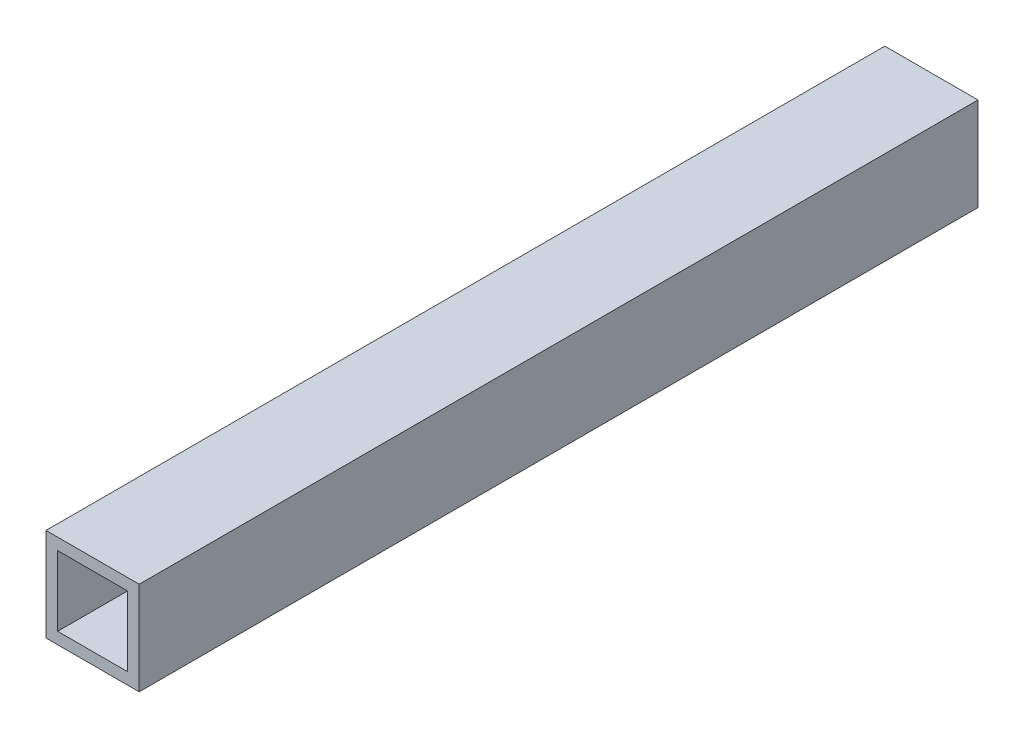
ISO-10303-21;
HEADER;
FILE_DESCRIPTION(('STEP AP214'),'2;1');
FILE_NAME('part.step','',(''),(''),'','','');
FILE_SCHEMA(('AUTOMOTIVE_DESIGN { 1 0 10303 214 1 1 1 1 }'));
ENDSEC;
DATA;
#1=APPLICATION_CONTEXT('core data for automotive mechanical design processes');
#2=APPLICATION_PROTOCOL_DEFINITION('international standard','automotive_design',2000,#1);
#3=PRODUCT_CONTEXT('',#1,'mechanical');
#4=PRODUCT('Part','Part','',(#3));
#5=PRODUCT_RELATED_PRODUCT_CATEGORY('part','',(#4));
#6=PRODUCT_DEFINITION_FORMATION('','',#4);
#7=PRODUCT_DEFINITION_CONTEXT('part definition',#1,'design');
#8=PRODUCT_DEFINITION('design','',#6,#7);
#9=PRODUCT_DEFINITION_SHAPE('','',#8);
#10=(LENGTH_UNIT() NAMED_UNIT(*) SI_UNIT(.MILLI.,.METRE.));
#11=(NAMED_UNIT(*) PLANE_ANGLE_UNIT() SI_UNIT($,.RADIAN.));
#12=(NAMED_UNIT(*) SI_UNIT($,.STERADIAN.) SOLID_ANGLE_UNIT());
#13=UNCERTAINTY_MEASURE_WITH_UNIT(LENGTH_MEASURE(1.E-05),#10,'distance_accuracy_value','');
#14=(GEOMETRIC_REPRESENTATION_CONTEXT(3) GLOBAL_UNCERTAINTY_ASSIGNED_CONTEXT((#13)) GLOBAL_UNIT_ASSIGNED_CONTEXT((#10,
#11,#12)) REPRESENTATION_CONTEXT('',''));
#15=CARTESIAN_POINT('',(0.,0.,0.));
#16=DIRECTION('',(0.,0.,1.));
#17=DIRECTION('',(1.,0.,0.));
#18=AXIS2_PLACEMENT_3D('',#15,#16,#17);
#19=CARTESIAN_POINT('',(0.,0.,114.3));
#20=DIRECTION('',(0.,0.,-1.));
#21=DIRECTION('',(-1.,0.,0.));
#22=AXIS2_PLACEMENT_3D('',#19,#20,#21);
#23=PLANE('',#22);
#24=DIRECTION('',(0.,1.,0.));
#25=VECTOR('',#24,1.);
#26=CARTESIAN_POINT('',(12.7,-12.7,114.3));
#27=LINE('',#26,#25);
#28=CARTESIAN_POINT('',(12.7,-12.7,114.3));
#29=VERTEX_POINT('',#28);
#30=CARTESIAN_POINT('',(12.7,12.7,114.3));
#31=VERTEX_POINT('',#30);
#32=EDGE_CURVE('E152',#29,#31,#27,.T.);
#33=ORIENTED_EDGE('',*,*,#32,.T.);
#34=DIRECTION('',(-1.,0.,0.));
#35=VECTOR('',#34,1.);
#36=CARTESIAN_POINT('',(-12.7,12.7,114.3));
#37=LINE('',#36,#35);
#38=CARTESIAN_POINT('',(-12.7,12.7,114.3));
#39=VERTEX_POINT('',#38);
#40=EDGE_CURVE('E156',#31,#39,#37,.T.);
#41=ORIENTED_EDGE('',*,*,#40,.T.);
#42=DIRECTION('',(0.,-1.,0.));
#43=VECTOR('',#42,1.);
#44=CARTESIAN_POINT('',(-12.7,-12.7,114.3));
#45=LINE('',#44,#43);
#46=CARTESIAN_POINT('',(-12.7,-12.7,114.3));
#47=VERTEX_POINT('',#46);
#48=EDGE_CURVE('E160',#39,#47,#45,.T.);
#49=ORIENTED_EDGE('',*,*,#48,.T.);
#50=DIRECTION('',(1.,0.,0.));
#51=VECTOR('',#50,1.);
#52=CARTESIAN_POINT('',(-12.7,-12.7,114.3));
#53=LINE('',#52,#51);
#54=EDGE_CURVE('E163',#47,#29,#53,.T.);
#55=ORIENTED_EDGE('',*,*,#54,.T.);
#56=EDGE_LOOP('',(#33,#41,#49,#55));
#57=FACE_BOUND('',#56,.T.);
#58=DIRECTION('',(0.,1.,0.));
#59=VECTOR('',#58,1.);
#60=CARTESIAN_POINT('',(9.525,0.,114.3));
#61=LINE('',#60,#59);
#62=CARTESIAN_POINT('',(9.525,-9.525,114.3));
#63=VERTEX_POINT('',#62);
#64=CARTESIAN_POINT('',(9.525,9.525,114.3));
#65=VERTEX_POINT('',#64);
#66=EDGE_CURVE('E134',#63,#65,#61,.T.);
#67=ORIENTED_EDGE('',*,*,#66,.F.);
#68=DIRECTION('',(1.,0.,0.));
#69=VECTOR('',#68,1.);
#70=CARTESIAN_POINT('',(0.,-9.525,114.3));
#71=LINE('',#70,#69);
#72=CARTESIAN_POINT('',(-9.525,-9.525,114.3));
#73=VERTEX_POINT('',#72);
#74=EDGE_CURVE('E116',#73,#63,#71,.T.);
#75=ORIENTED_EDGE('',*,*,#74,.F.);
#76=DIRECTION('',(0.,-1.,0.));
#77=VECTOR('',#76,1.);
#78=CARTESIAN_POINT('',(-9.525,0.,114.3));
#79=LINE('',#78,#77);
#80=CARTESIAN_POINT('',(-9.525,9.525,114.3));
#81=VERTEX_POINT('',#80);
#82=EDGE_CURVE('E147',#81,#73,#79,.T.);
#83=ORIENTED_EDGE('',*,*,#82,.F.);
#84=DIRECTION('',(-1.,0.,0.));
#85=VECTOR('',#84,1.);
#86=CARTESIAN_POINT('',(0.,9.525,114.3));
#87=LINE('',#86,#85);
#88=EDGE_CURVE('E138',#65,#81,#87,.T.);
#89=ORIENTED_EDGE('',*,*,#88,.F.);
#90=EDGE_LOOP('',(#67,#75,#83,#89));
#91=FACE_BOUND('',#90,.T.);
#92=ADVANCED_FACE('F45',(#57,#91),#23,.F.);
#93=CARTESIAN_POINT('',(0.,0.,-114.3));
#94=DIRECTION('',(0.,0.,-1.));
#95=DIRECTION('',(-1.,0.,0.));
#96=AXIS2_PLACEMENT_3D('',#93,#94,#95);
#97=PLANE('',#96);
#98=DIRECTION('',(0.,1.,0.));
#99=VECTOR('',#98,1.);
#100=CARTESIAN_POINT('',(12.7,-12.7,-114.3));
#101=LINE('',#100,#99);
#102=CARTESIAN_POINT('',(12.7,-12.7,-114.3));
#103=VERTEX_POINT('',#102);
#104=CARTESIAN_POINT('',(12.7,12.7,-114.3));
#105=VERTEX_POINT('',#104);
#106=EDGE_CURVE('E167',#103,#105,#101,.T.);
#107=ORIENTED_EDGE('',*,*,#106,.F.);
#108=DIRECTION('',(1.,0.,0.));
#109=VECTOR('',#108,1.);
#110=CARTESIAN_POINT('',(-12.7,-12.7,-114.3));
#111=LINE('',#110,#109);
#112=CARTESIAN_POINT('',(-12.7,-12.7,-114.3));
#113=VERTEX_POINT('',#112);
#114=EDGE_CURVE('E157',#113,#103,#111,.T.);
#115=ORIENTED_EDGE('',*,*,#114,.F.);
#116=DIRECTION('',(0.,-1.,0.));
#117=VECTOR('',#116,1.);
#118=CARTESIAN_POINT('',(-12.7,-12.7,-114.3));
#119=LINE('',#118,#117);
#120=CARTESIAN_POINT('',(-12.7,12.7,-114.3));
#121=VERTEX_POINT('',#120);
#122=EDGE_CURVE('E174',#121,#113,#119,.T.);
#123=ORIENTED_EDGE('',*,*,#122,.F.);
#124=DIRECTION('',(-1.,0.,0.));
#125=VECTOR('',#124,1.);
#126=CARTESIAN_POINT('',(-12.7,12.7,-114.3));
#127=LINE('',#126,#125);
#128=EDGE_CURVE('E171',#105,#121,#127,.T.);
#129=ORIENTED_EDGE('',*,*,#128,.F.);
#130=EDGE_LOOP('',(#107,#115,#123,#129));
#131=FACE_BOUND('',#130,.T.);
#132=DIRECTION('',(1.,0.,0.));
#133=VECTOR('',#132,1.);
#134=CARTESIAN_POINT('',(0.,-9.525,-114.3));
#135=LINE('',#134,#133);
#136=CARTESIAN_POINT('',(-9.525,-9.525,-114.3));
#137=VERTEX_POINT('',#136);
#138=CARTESIAN_POINT('',(9.525,-9.525,-114.3));
#139=VERTEX_POINT('',#138);
#140=EDGE_CURVE('E114',#137,#139,#135,.T.);
#141=ORIENTED_EDGE('',*,*,#140,.T.);
#142=DIRECTION('',(0.,1.,0.));
#143=VECTOR('',#142,1.);
#144=CARTESIAN_POINT('',(9.525,0.,-114.3));
#145=LINE('',#144,#143);
#146=CARTESIAN_POINT('',(9.525,9.525,-114.3));
#147=VERTEX_POINT('',#146);
#148=EDGE_CURVE('E123',#139,#147,#145,.T.);
#149=ORIENTED_EDGE('',*,*,#148,.T.);
#150=DIRECTION('',(-1.,0.,0.));
#151=VECTOR('',#150,1.);
#152=CARTESIAN_POINT('',(0.,9.525,-114.3));
#153=LINE('',#152,#151);
#154=CARTESIAN_POINT('',(-9.525,9.525,-114.3));
#155=VERTEX_POINT('',#154);
#156=EDGE_CURVE('E130',#147,#155,#153,.T.);
#157=ORIENTED_EDGE('',*,*,#156,.T.);
#158=DIRECTION('',(0.,-1.,0.));
#159=VECTOR('',#158,1.);
#160=CARTESIAN_POINT('',(-9.525,0.,-114.3));
#161=LINE('',#160,#159);
#162=EDGE_CURVE('E68',#155,#137,#161,.T.);
#163=ORIENTED_EDGE('',*,*,#162,.T.);
#164=EDGE_LOOP('',(#141,#149,#157,#163));
#165=FACE_BOUND('',#164,.T.);
#166=ADVANCED_FACE('F132',(#131,#165),#97,.T.);
#167=CARTESIAN_POINT('',(12.7,-12.7,114.3));
#168=DIRECTION('',(-1.,0.,0.));
#169=DIRECTION('',(0.,0.,1.));
#170=AXIS2_PLACEMENT_3D('',#167,#168,#169);
#171=PLANE('',#170);
#172=ORIENTED_EDGE('',*,*,#106,.T.);
#173=DIRECTION('',(0.,0.,-1.));
#174=VECTOR('',#173,1.);
#175=CARTESIAN_POINT('',(12.7,12.7,114.3));
#176=LINE('',#175,#174);
#177=EDGE_CURVE('E11',#31,#105,#176,.T.);
#178=ORIENTED_EDGE('',*,*,#177,.F.);
#179=ORIENTED_EDGE('',*,*,#32,.F.);
#180=DIRECTION('',(0.,0.,-1.));
#181=VECTOR('',#180,1.);
#182=CARTESIAN_POINT('',(12.7,-12.7,114.3));
#183=LINE('',#182,#181);
#184=EDGE_CURVE('E166',#29,#103,#183,.T.);
#185=ORIENTED_EDGE('',*,*,#184,.T.);
#186=EDGE_LOOP('',(#172,#178,#179,#185));
#187=FACE_BOUND('',#186,.T.);
#188=ADVANCED_FACE('F47',(#187),#171,.F.);
#189=CARTESIAN_POINT('',(-12.7,12.7,114.3));
#190=DIRECTION('',(0.,-1.,0.));
#191=DIRECTION('',(0.,0.,-1.));
#192=AXIS2_PLACEMENT_3D('',#189,#190,#191);
#193=PLANE('',#192);
#194=ORIENTED_EDGE('',*,*,#128,.T.);
#195=DIRECTION('',(0.,0.,-1.));
#196=VECTOR('',#195,1.);
#197=CARTESIAN_POINT('',(-12.7,12.7,114.3));
#198=LINE('',#197,#196);
#199=EDGE_CURVE('E54',#39,#121,#198,.T.);
#200=ORIENTED_EDGE('',*,*,#199,.F.);
#201=ORIENTED_EDGE('',*,*,#40,.F.);
#202=ORIENTED_EDGE('',*,*,#177,.T.);
#203=EDGE_LOOP('',(#194,#200,#201,#202));
#204=FACE_BOUND('',#203,.T.);
#205=ADVANCED_FACE('F206',(#204),#193,.F.);
#206=CARTESIAN_POINT('',(-12.7,-12.7,114.3));
#207=DIRECTION('',(1.,0.,0.));
#208=DIRECTION('',(0.,0.,-1.));
#209=AXIS2_PLACEMENT_3D('',#206,#207,#208);
#210=PLANE('',#209);
#211=ORIENTED_EDGE('',*,*,#122,.T.);
#212=DIRECTION('',(0.,0.,-1.));
#213=VECTOR('',#212,1.);
#214=CARTESIAN_POINT('',(-12.7,-12.7,114.3));
#215=LINE('',#214,#213);
#216=EDGE_CURVE('E182',#47,#113,#215,.T.);
#217=ORIENTED_EDGE('',*,*,#216,.F.);
#218=ORIENTED_EDGE('',*,*,#48,.F.);
#219=ORIENTED_EDGE('',*,*,#199,.T.);
#220=EDGE_LOOP('',(#211,#217,#218,#219));
#221=FACE_BOUND('',#220,.T.);
#222=ADVANCED_FACE('F191',(#221),#210,.F.);
#223=CARTESIAN_POINT('',(-12.7,-12.7,114.3));
#224=DIRECTION('',(0.,1.,0.));
#225=DIRECTION('',(0.,0.,1.));
#226=AXIS2_PLACEMENT_3D('',#223,#224,#225);
#227=PLANE('',#226);
#228=ORIENTED_EDGE('',*,*,#114,.T.);
#229=ORIENTED_EDGE('',*,*,#184,.F.);
#230=ORIENTED_EDGE('',*,*,#54,.F.);
#231=ORIENTED_EDGE('',*,*,#216,.T.);
#232=EDGE_LOOP('',(#228,#229,#230,#231));
#233=FACE_BOUND('',#232,.T.);
#234=ADVANCED_FACE('F199',(#233),#227,.F.);
#235=CARTESIAN_POINT('',(9.525,-12.7,114.3));
#236=DIRECTION('',(-1.,0.,0.));
#237=DIRECTION('',(0.,0.,1.));
#238=AXIS2_PLACEMENT_3D('',#235,#236,#237);
#239=PLANE('',#238);
#240=ORIENTED_EDGE('',*,*,#148,.F.);
#241=DIRECTION('',(0.,0.,-1.));
#242=VECTOR('',#241,1.);
#243=CARTESIAN_POINT('',(9.525,-9.525,114.3));
#244=LINE('',#243,#242);
#245=EDGE_CURVE('E110',#63,#139,#244,.T.);
#246=ORIENTED_EDGE('',*,*,#245,.F.);
#247=ORIENTED_EDGE('',*,*,#66,.T.);
#248=DIRECTION('',(0.,0.,-1.));
#249=VECTOR('',#248,1.);
#250=CARTESIAN_POINT('',(9.525,9.525,114.3));
#251=LINE('',#250,#249);
#252=EDGE_CURVE('E126',#65,#147,#251,.T.);
#253=ORIENTED_EDGE('',*,*,#252,.T.);
#254=EDGE_LOOP('',(#240,#246,#247,#253));
#255=FACE_BOUND('',#254,.T.);
#256=ADVANCED_FACE('F124',(#255),#239,.T.);
#257=CARTESIAN_POINT('',(-12.7,9.525,114.3));
#258=DIRECTION('',(0.,-1.,0.));
#259=DIRECTION('',(0.,0.,-1.));
#260=AXIS2_PLACEMENT_3D('',#257,#258,#259);
#261=PLANE('',#260);
#262=ORIENTED_EDGE('',*,*,#156,.F.);
#263=ORIENTED_EDGE('',*,*,#252,.F.);
#264=ORIENTED_EDGE('',*,*,#88,.T.);
#265=DIRECTION('',(0.,0.,-1.));
#266=VECTOR('',#265,1.);
#267=CARTESIAN_POINT('',(-9.525,9.525,114.3));
#268=LINE('',#267,#266);
#269=EDGE_CURVE('E289',#81,#155,#268,.T.);
#270=ORIENTED_EDGE('',*,*,#269,.T.);
#271=EDGE_LOOP('',(#262,#263,#264,#270));
#272=FACE_BOUND('',#271,.T.);
#273=ADVANCED_FACE('F226',(#272),#261,.T.);
#274=CARTESIAN_POINT('',(-9.525,-12.7,114.3));
#275=DIRECTION('',(1.,0.,0.));
#276=DIRECTION('',(0.,0.,-1.));
#277=AXIS2_PLACEMENT_3D('',#274,#275,#276);
#278=PLANE('',#277);
#279=ORIENTED_EDGE('',*,*,#162,.F.);
#280=ORIENTED_EDGE('',*,*,#269,.F.);
#281=ORIENTED_EDGE('',*,*,#82,.T.);
#282=DIRECTION('',(0.,0.,-1.));
#283=VECTOR('',#282,1.);
#284=CARTESIAN_POINT('',(-9.525,-9.525,114.3));
#285=LINE('',#284,#283);
#286=EDGE_CURVE('E61',#73,#137,#285,.T.);
#287=ORIENTED_EDGE('',*,*,#286,.T.);
#288=EDGE_LOOP('',(#279,#280,#281,#287));
#289=FACE_BOUND('',#288,.T.);
#290=ADVANCED_FACE('F231',(#289),#278,.T.);
#291=CARTESIAN_POINT('',(-12.7,-9.525,114.3));
#292=DIRECTION('',(0.,1.,0.));
#293=DIRECTION('',(0.,0.,1.));
#294=AXIS2_PLACEMENT_3D('',#291,#292,#293);
#295=PLANE('',#294);
#296=ORIENTED_EDGE('',*,*,#140,.F.);
#297=ORIENTED_EDGE('',*,*,#286,.F.);
#298=ORIENTED_EDGE('',*,*,#74,.T.);
#299=ORIENTED_EDGE('',*,*,#245,.T.);
#300=EDGE_LOOP('',(#296,#297,#298,#299));
#301=FACE_BOUND('',#300,.T.);
#302=ADVANCED_FACE('F112',(#301),#295,.T.);
#303=CLOSED_SHELL('',(#92,#166,#188,#205,#222,#234,#256,#273,#290,#302));
#304=MANIFOLD_SOLID_BREP('B2',#303);
#305=ADVANCED_BREP_SHAPE_REPRESENTATION('',(#18,#304),#14);
#306=SHAPE_DEFINITION_REPRESENTATION(#9,#305);
ENDSEC;
END-ISO-10303-21;
